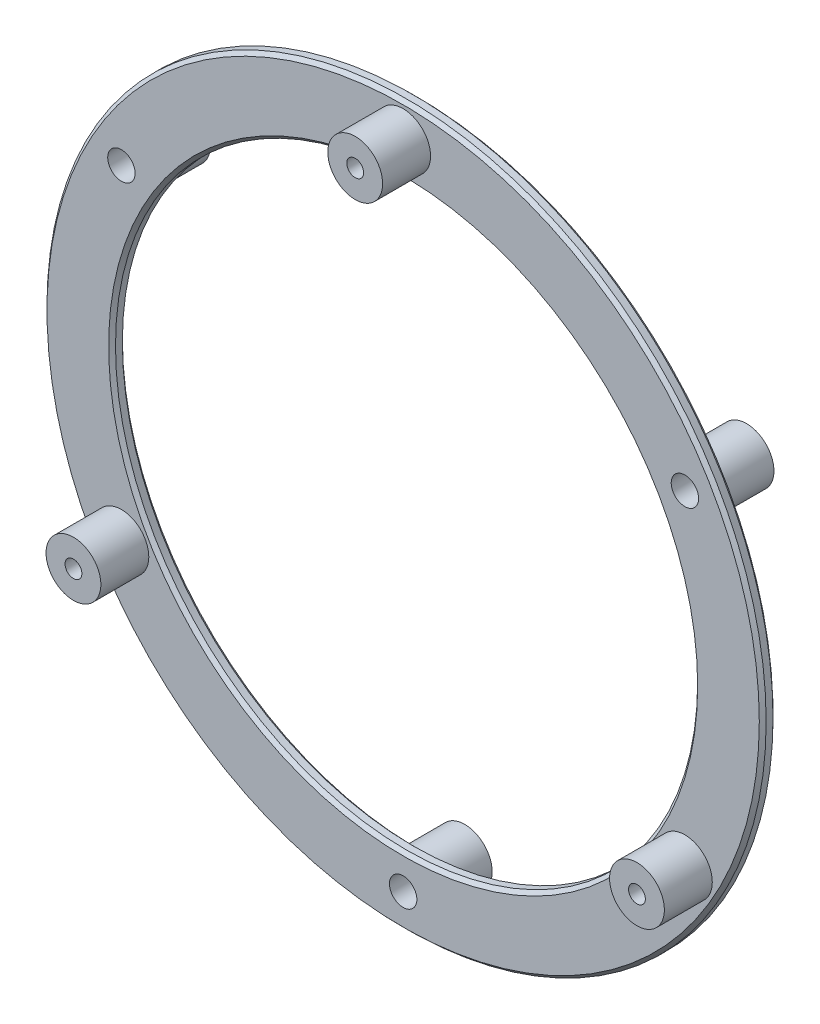
ISO-10303-21;
HEADER;
FILE_DESCRIPTION(('STEP AP214'),'2;1');
FILE_NAME('part.step','',(''),(''),'','','');
FILE_SCHEMA(('AUTOMOTIVE_DESIGN { 1 0 10303 214 1 1 1 1 }'));
ENDSEC;
DATA;
#1=APPLICATION_CONTEXT('core data for automotive mechanical design processes');
#2=APPLICATION_PROTOCOL_DEFINITION('international standard','automotive_design',2000,#1);
#3=PRODUCT_CONTEXT('',#1,'mechanical');
#4=PRODUCT('Part','Part','',(#3));
#5=PRODUCT_RELATED_PRODUCT_CATEGORY('part','',(#4));
#6=PRODUCT_DEFINITION_FORMATION('','',#4);
#7=PRODUCT_DEFINITION_CONTEXT('part definition',#1,'design');
#8=PRODUCT_DEFINITION('design','',#6,#7);
#9=PRODUCT_DEFINITION_SHAPE('','',#8);
#10=(LENGTH_UNIT() NAMED_UNIT(*) SI_UNIT(.MILLI.,.METRE.));
#11=(NAMED_UNIT(*) PLANE_ANGLE_UNIT() SI_UNIT($,.RADIAN.));
#12=(NAMED_UNIT(*) SI_UNIT($,.STERADIAN.) SOLID_ANGLE_UNIT());
#13=UNCERTAINTY_MEASURE_WITH_UNIT(LENGTH_MEASURE(1.E-05),#10,'distance_accuracy_value','');
#14=(GEOMETRIC_REPRESENTATION_CONTEXT(3) GLOBAL_UNCERTAINTY_ASSIGNED_CONTEXT((#13)) GLOBAL_UNIT_ASSIGNED_CONTEXT((#10,
#11,#12)) REPRESENTATION_CONTEXT('',''));
#15=CARTESIAN_POINT('',(0.,0.,0.));
#16=DIRECTION('',(0.,0.,1.));
#17=DIRECTION('',(1.,0.,0.));
#18=AXIS2_PLACEMENT_3D('',#15,#16,#17);
#19=CARTESIAN_POINT('',(0.,0.,2.));
#20=DIRECTION('',(0.,0.,-1.));
#21=DIRECTION('',(-1.,0.,0.));
#22=AXIS2_PLACEMENT_3D('',#19,#20,#21);
#23=CYLINDRICAL_SURFACE('',#22,52.5);
#24=CARTESIAN_POINT('',(0.,0.,0.500000000000007));
#25=DIRECTION('',(0.,0.,-1.));
#26=DIRECTION('',(-1.,0.,0.));
#27=AXIS2_PLACEMENT_3D('',#24,#25,#26);
#28=CIRCLE('',#27,52.5);
#29=CARTESIAN_POINT('',(-52.5,0.,0.500000000000007));
#30=VERTEX_POINT('',#29);
#31=EDGE_CURVE('E61',#30,#30,#28,.F.);
#32=ORIENTED_EDGE('',*,*,#31,.T.);
#33=EDGE_LOOP('',(#32));
#34=FACE_BOUND('',#33,.T.);
#35=CARTESIAN_POINT('',(0.,0.,1.50000000000003));
#36=DIRECTION('',(0.,0.,1.));
#37=DIRECTION('',(1.,0.,0.));
#38=AXIS2_PLACEMENT_3D('',#35,#36,#37);
#39=CIRCLE('',#38,52.5);
#40=CARTESIAN_POINT('',(52.5,0.,1.50000000000003));
#41=VERTEX_POINT('',#40);
#42=EDGE_CURVE('E64',#41,#41,#39,.F.);
#43=ORIENTED_EDGE('',*,*,#42,.T.);
#44=EDGE_LOOP('',(#43));
#45=FACE_BOUND('',#44,.T.);
#46=ADVANCED_FACE('F41',(#34,#45),#23,.T.);
#47=CARTESIAN_POINT('',(52.5,0.,2.));
#48=DIRECTION('',(0.,0.,1.));
#49=DIRECTION('',(1.,0.,0.));
#50=AXIS2_PLACEMENT_3D('',#47,#48,#49);
#51=PLANE('',#50);
#52=CARTESIAN_POINT('',(0.,0.,2.));
#53=DIRECTION('',(0.,0.,1.));
#54=DIRECTION('',(1.,0.,0.));
#55=AXIS2_PLACEMENT_3D('',#52,#53,#54);
#56=CIRCLE('',#55,52.);
#57=CARTESIAN_POINT('',(52.,0.,2.));
#58=VERTEX_POINT('',#57);
#59=EDGE_CURVE('E52',#58,#58,#56,.T.);
#60=ORIENTED_EDGE('',*,*,#59,.T.);
#61=EDGE_LOOP('',(#60));
#62=FACE_BOUND('',#61,.T.);
#63=CARTESIAN_POINT('',(0.,0.,2.));
#64=DIRECTION('',(0.,0.,1.));
#65=DIRECTION('',(1.,0.,0.));
#66=AXIS2_PLACEMENT_3D('',#63,#64,#65);
#67=CIRCLE('',#66,43.);
#68=CARTESIAN_POINT('',(43.,0.,2.));
#69=VERTEX_POINT('',#68);
#70=EDGE_CURVE('E56',#69,#69,#67,.F.);
#71=ORIENTED_EDGE('',*,*,#70,.T.);
#72=EDGE_LOOP('',(#71));
#73=FACE_BOUND('',#72,.T.);
#74=CARTESIAN_POINT('',(41.1362066797609,23.75,2.));
#75=DIRECTION('',(0.,0.,1.));
#76=DIRECTION('',(1.,0.,0.));
#77=AXIS2_PLACEMENT_3D('',#74,#75,#76);
#78=CIRCLE('',#77,1.99999999999999);
#79=CARTESIAN_POINT('',(43.1362066797608,23.75,2.));
#80=VERTEX_POINT('',#79);
#81=EDGE_CURVE('E139',#80,#80,#78,.T.);
#82=ORIENTED_EDGE('',*,*,#81,.F.);
#83=EDGE_LOOP('',(#82));
#84=FACE_BOUND('',#83,.T.);
#85=CARTESIAN_POINT('',(0.,-47.5,2.));
#86=DIRECTION('',(0.,0.,1.));
#87=DIRECTION('',(1.,0.,0.));
#88=AXIS2_PLACEMENT_3D('',#85,#86,#87);
#89=CIRCLE('',#88,1.99999999999999);
#90=CARTESIAN_POINT('',(2.,-47.5,2.));
#91=VERTEX_POINT('',#90);
#92=EDGE_CURVE('E133',#91,#91,#89,.T.);
#93=ORIENTED_EDGE('',*,*,#92,.F.);
#94=EDGE_LOOP('',(#93));
#95=FACE_BOUND('',#94,.T.);
#96=CARTESIAN_POINT('',(-41.1362066797608,23.75,2.));
#97=DIRECTION('',(0.,0.,1.));
#98=DIRECTION('',(1.,0.,0.));
#99=AXIS2_PLACEMENT_3D('',#96,#97,#98);
#100=CIRCLE('',#99,1.99999999999999);
#101=CARTESIAN_POINT('',(-39.1362066797608,23.75,2.));
#102=VERTEX_POINT('',#101);
#103=EDGE_CURVE('E127',#102,#102,#100,.T.);
#104=ORIENTED_EDGE('',*,*,#103,.F.);
#105=EDGE_LOOP('',(#104));
#106=FACE_BOUND('',#105,.T.);
#107=CARTESIAN_POINT('',(0.,47.5,2.));
#108=DIRECTION('',(0.,0.,1.));
#109=DIRECTION('',(1.,0.,0.));
#110=AXIS2_PLACEMENT_3D('',#107,#108,#109);
#111=CIRCLE('',#110,4.);
#112=CARTESIAN_POINT('',(4.,47.5,2.));
#113=VERTEX_POINT('',#112);
#114=EDGE_CURVE('E82',#113,#113,#111,.T.);
#115=ORIENTED_EDGE('',*,*,#114,.F.);
#116=EDGE_LOOP('',(#115));
#117=FACE_BOUND('',#116,.T.);
#118=CARTESIAN_POINT('',(-41.1362066797608,-23.75,2.));
#119=DIRECTION('',(0.,0.,1.));
#120=DIRECTION('',(1.,0.,0.));
#121=AXIS2_PLACEMENT_3D('',#118,#119,#120);
#122=CIRCLE('',#121,4.);
#123=CARTESIAN_POINT('',(-37.1362066797608,-23.75,2.));
#124=VERTEX_POINT('',#123);
#125=EDGE_CURVE('E85',#124,#124,#122,.T.);
#126=ORIENTED_EDGE('',*,*,#125,.F.);
#127=EDGE_LOOP('',(#126));
#128=FACE_BOUND('',#127,.T.);
#129=CARTESIAN_POINT('',(41.1362066797608,-23.75,2.));
#130=DIRECTION('',(0.,0.,1.));
#131=DIRECTION('',(1.,0.,0.));
#132=AXIS2_PLACEMENT_3D('',#129,#130,#131);
#133=CIRCLE('',#132,4.);
#134=CARTESIAN_POINT('',(45.1362066797608,-23.75,2.));
#135=VERTEX_POINT('',#134);
#136=EDGE_CURVE('E88',#135,#135,#133,.T.);
#137=ORIENTED_EDGE('',*,*,#136,.F.);
#138=EDGE_LOOP('',(#137));
#139=FACE_BOUND('',#138,.T.);
#140=ADVANCED_FACE('F165',(#62,#73,#84,#95,#106,#117,#128,#139),#51,.T.);
#141=CARTESIAN_POINT('',(0.,0.,0.));
#142=DIRECTION('',(0.,0.,-1.));
#143=DIRECTION('',(-1.,0.,0.));
#144=AXIS2_PLACEMENT_3D('',#141,#142,#143);
#145=PLANE('',#144);
#146=CARTESIAN_POINT('',(0.,0.,0.));
#147=DIRECTION('',(0.,0.,-1.));
#148=DIRECTION('',(-1.,0.,0.));
#149=AXIS2_PLACEMENT_3D('',#146,#147,#148);
#150=CIRCLE('',#149,52.);
#151=CARTESIAN_POINT('',(-52.,0.,0.));
#152=VERTEX_POINT('',#151);
#153=EDGE_CURVE('E67',#152,#152,#150,.T.);
#154=ORIENTED_EDGE('',*,*,#153,.T.);
#155=EDGE_LOOP('',(#154));
#156=FACE_BOUND('',#155,.T.);
#157=CARTESIAN_POINT('',(0.,0.,0.));
#158=DIRECTION('',(0.,0.,-1.));
#159=DIRECTION('',(-1.,0.,0.));
#160=AXIS2_PLACEMENT_3D('',#157,#158,#159);
#161=CIRCLE('',#160,43.);
#162=CARTESIAN_POINT('',(-43.,0.,0.));
#163=VERTEX_POINT('',#162);
#164=EDGE_CURVE('E70',#163,#163,#161,.F.);
#165=ORIENTED_EDGE('',*,*,#164,.T.);
#166=EDGE_LOOP('',(#165));
#167=FACE_BOUND('',#166,.T.);
#168=CARTESIAN_POINT('',(41.1362066797608,-23.75,0.));
#169=DIRECTION('',(0.,0.,1.));
#170=DIRECTION('',(1.,0.,0.));
#171=AXIS2_PLACEMENT_3D('',#168,#169,#170);
#172=CIRCLE('',#171,1.2295);
#173=CARTESIAN_POINT('',(42.3657066797608,-23.75,0.));
#174=VERTEX_POINT('',#173);
#175=EDGE_CURVE('E121',#174,#174,#172,.T.);
#176=ORIENTED_EDGE('',*,*,#175,.T.);
#177=EDGE_LOOP('',(#176));
#178=FACE_BOUND('',#177,.T.);
#179=CARTESIAN_POINT('',(-41.1362066797608,-23.75,0.));
#180=DIRECTION('',(0.,0.,1.));
#181=DIRECTION('',(1.,0.,0.));
#182=AXIS2_PLACEMENT_3D('',#179,#180,#181);
#183=CIRCLE('',#182,1.2295);
#184=CARTESIAN_POINT('',(-39.9067066797608,-23.75,0.));
#185=VERTEX_POINT('',#184);
#186=EDGE_CURVE('E115',#185,#185,#183,.T.);
#187=ORIENTED_EDGE('',*,*,#186,.T.);
#188=EDGE_LOOP('',(#187));
#189=FACE_BOUND('',#188,.T.);
#190=CARTESIAN_POINT('',(0.,47.5,0.));
#191=DIRECTION('',(0.,0.,1.));
#192=DIRECTION('',(1.,0.,0.));
#193=AXIS2_PLACEMENT_3D('',#190,#191,#192);
#194=CIRCLE('',#193,1.2295);
#195=CARTESIAN_POINT('',(1.2295,47.5,0.));
#196=VERTEX_POINT('',#195);
#197=EDGE_CURVE('E109',#196,#196,#194,.T.);
#198=ORIENTED_EDGE('',*,*,#197,.T.);
#199=EDGE_LOOP('',(#198));
#200=FACE_BOUND('',#199,.T.);
#201=CARTESIAN_POINT('',(0.,-47.5,0.));
#202=DIRECTION('',(0.,0.,-1.));
#203=DIRECTION('',(-1.,0.,0.));
#204=AXIS2_PLACEMENT_3D('',#201,#202,#203);
#205=CIRCLE('',#204,4.);
#206=CARTESIAN_POINT('',(-3.99999999999999,-47.5,0.));
#207=VERTEX_POINT('',#206);
#208=EDGE_CURVE('E73',#207,#207,#205,.T.);
#209=ORIENTED_EDGE('',*,*,#208,.F.);
#210=EDGE_LOOP('',(#209));
#211=FACE_BOUND('',#210,.T.);
#212=CARTESIAN_POINT('',(-41.1362066797608,23.75,0.));
#213=DIRECTION('',(0.,0.,-1.));
#214=DIRECTION('',(-1.,0.,0.));
#215=AXIS2_PLACEMENT_3D('',#212,#213,#214);
#216=CIRCLE('',#215,4.);
#217=CARTESIAN_POINT('',(-45.1362066797608,23.75,0.));
#218=VERTEX_POINT('',#217);
#219=EDGE_CURVE('E76',#218,#218,#216,.T.);
#220=ORIENTED_EDGE('',*,*,#219,.F.);
#221=EDGE_LOOP('',(#220));
#222=FACE_BOUND('',#221,.T.);
#223=CARTESIAN_POINT('',(41.1362066797609,23.75,0.));
#224=DIRECTION('',(0.,0.,-1.));
#225=DIRECTION('',(-1.,0.,0.));
#226=AXIS2_PLACEMENT_3D('',#223,#224,#225);
#227=CIRCLE('',#226,4.);
#228=CARTESIAN_POINT('',(37.1362066797608,23.75,0.));
#229=VERTEX_POINT('',#228);
#230=EDGE_CURVE('E79',#229,#229,#227,.T.);
#231=ORIENTED_EDGE('',*,*,#230,.F.);
#232=EDGE_LOOP('',(#231));
#233=FACE_BOUND('',#232,.T.);
#234=ADVANCED_FACE('F162',(#156,#167,#178,#189,#200,#211,#222,#233),#145,.T.);
#235=CARTESIAN_POINT('',(41.1362066797608,-23.75,9.));
#236=DIRECTION('',(0.,0.,-1.));
#237=DIRECTION('',(-1.,0.,0.));
#238=AXIS2_PLACEMENT_3D('',#235,#236,#237);
#239=CYLINDRICAL_SURFACE('',#238,4.);
#240=CARTESIAN_POINT('',(41.1362066797608,-23.75,9.));
#241=DIRECTION('',(0.,0.,-1.));
#242=DIRECTION('',(-1.,0.,0.));
#243=AXIS2_PLACEMENT_3D('',#240,#241,#242);
#244=CIRCLE('',#243,4.);
#245=CARTESIAN_POINT('',(37.1362066797608,-23.75,9.));
#246=VERTEX_POINT('',#245);
#247=EDGE_CURVE('E91',#246,#246,#244,.T.);
#248=ORIENTED_EDGE('',*,*,#247,.T.);
#249=EDGE_LOOP('',(#248));
#250=FACE_BOUND('',#249,.T.);
#251=ORIENTED_EDGE('',*,*,#136,.T.);
#252=EDGE_LOOP('',(#251));
#253=FACE_BOUND('',#252,.T.);
#254=ADVANCED_FACE('F164',(#250,#253),#239,.T.);
#255=CARTESIAN_POINT('',(45.1362066797608,-23.75,9.));
#256=DIRECTION('',(0.,0.,1.));
#257=DIRECTION('',(1.,0.,0.));
#258=AXIS2_PLACEMENT_3D('',#255,#256,#257);
#259=PLANE('',#258);
#260=CARTESIAN_POINT('',(41.1362066797608,-23.75,9.00000000000001));
#261=DIRECTION('',(0.,0.,1.));
#262=DIRECTION('',(1.,0.,0.));
#263=AXIS2_PLACEMENT_3D('',#260,#261,#262);
#264=CIRCLE('',#263,1.2295);
#265=CARTESIAN_POINT('',(42.3657066797608,-23.75,9.00000000000001));
#266=VERTEX_POINT('',#265);
#267=EDGE_CURVE('E124',#266,#266,#264,.T.);
#268=ORIENTED_EDGE('',*,*,#267,.F.);
#269=EDGE_LOOP('',(#268));
#270=FACE_BOUND('',#269,.T.);
#271=ORIENTED_EDGE('',*,*,#247,.F.);
#272=EDGE_LOOP('',(#271));
#273=FACE_BOUND('',#272,.T.);
#274=ADVANCED_FACE('F172',(#270,#273),#259,.T.);
#275=CARTESIAN_POINT('',(-41.1362066797608,-23.75,9.));
#276=DIRECTION('',(0.,0.,-1.));
#277=DIRECTION('',(-1.,0.,0.));
#278=AXIS2_PLACEMENT_3D('',#275,#276,#277);
#279=CYLINDRICAL_SURFACE('',#278,4.);
#280=CARTESIAN_POINT('',(-41.1362066797608,-23.75,9.));
#281=DIRECTION('',(0.,0.,-1.));
#282=DIRECTION('',(-1.,0.,0.));
#283=AXIS2_PLACEMENT_3D('',#280,#281,#282);
#284=CIRCLE('',#283,4.);
#285=CARTESIAN_POINT('',(-45.1362066797608,-23.75,9.));
#286=VERTEX_POINT('',#285);
#287=EDGE_CURVE('E94',#286,#286,#284,.T.);
#288=ORIENTED_EDGE('',*,*,#287,.T.);
#289=EDGE_LOOP('',(#288));
#290=FACE_BOUND('',#289,.T.);
#291=ORIENTED_EDGE('',*,*,#125,.T.);
#292=EDGE_LOOP('',(#291));
#293=FACE_BOUND('',#292,.T.);
#294=ADVANCED_FACE('F235',(#290,#293),#279,.T.);
#295=CARTESIAN_POINT('',(-37.1362066797608,-23.75,9.));
#296=DIRECTION('',(0.,0.,1.));
#297=DIRECTION('',(1.,0.,0.));
#298=AXIS2_PLACEMENT_3D('',#295,#296,#297);
#299=PLANE('',#298);
#300=CARTESIAN_POINT('',(-41.1362066797608,-23.75,9.00000000000001));
#301=DIRECTION('',(0.,0.,1.));
#302=DIRECTION('',(1.,0.,0.));
#303=AXIS2_PLACEMENT_3D('',#300,#301,#302);
#304=CIRCLE('',#303,1.2295);
#305=CARTESIAN_POINT('',(-39.9067066797608,-23.75,9.00000000000001));
#306=VERTEX_POINT('',#305);
#307=EDGE_CURVE('E118',#306,#306,#304,.T.);
#308=ORIENTED_EDGE('',*,*,#307,.F.);
#309=EDGE_LOOP('',(#308));
#310=FACE_BOUND('',#309,.T.);
#311=ORIENTED_EDGE('',*,*,#287,.F.);
#312=EDGE_LOOP('',(#311));
#313=FACE_BOUND('',#312,.T.);
#314=ADVANCED_FACE('F231',(#310,#313),#299,.T.);
#315=CARTESIAN_POINT('',(0.,47.5,9.));
#316=DIRECTION('',(0.,0.,-1.));
#317=DIRECTION('',(-1.,0.,0.));
#318=AXIS2_PLACEMENT_3D('',#315,#316,#317);
#319=CYLINDRICAL_SURFACE('',#318,4.);
#320=CARTESIAN_POINT('',(0.,47.5,9.));
#321=DIRECTION('',(0.,0.,-1.));
#322=DIRECTION('',(-1.,0.,0.));
#323=AXIS2_PLACEMENT_3D('',#320,#321,#322);
#324=CIRCLE('',#323,4.);
#325=CARTESIAN_POINT('',(-4.,47.5,9.));
#326=VERTEX_POINT('',#325);
#327=EDGE_CURVE('E97',#326,#326,#324,.T.);
#328=ORIENTED_EDGE('',*,*,#327,.T.);
#329=EDGE_LOOP('',(#328));
#330=FACE_BOUND('',#329,.T.);
#331=ORIENTED_EDGE('',*,*,#114,.T.);
#332=EDGE_LOOP('',(#331));
#333=FACE_BOUND('',#332,.T.);
#334=ADVANCED_FACE('F227',(#330,#333),#319,.T.);
#335=CARTESIAN_POINT('',(4.,47.5,9.));
#336=DIRECTION('',(0.,0.,1.));
#337=DIRECTION('',(1.,0.,0.));
#338=AXIS2_PLACEMENT_3D('',#335,#336,#337);
#339=PLANE('',#338);
#340=CARTESIAN_POINT('',(0.,47.5,9.00000000000001));
#341=DIRECTION('',(0.,0.,1.));
#342=DIRECTION('',(1.,0.,0.));
#343=AXIS2_PLACEMENT_3D('',#340,#341,#342);
#344=CIRCLE('',#343,1.2295);
#345=CARTESIAN_POINT('',(1.2295,47.5,9.00000000000001));
#346=VERTEX_POINT('',#345);
#347=EDGE_CURVE('E112',#346,#346,#344,.T.);
#348=ORIENTED_EDGE('',*,*,#347,.F.);
#349=EDGE_LOOP('',(#348));
#350=FACE_BOUND('',#349,.T.);
#351=ORIENTED_EDGE('',*,*,#327,.F.);
#352=EDGE_LOOP('',(#351));
#353=FACE_BOUND('',#352,.T.);
#354=ADVANCED_FACE('F158',(#350,#353),#339,.T.);
#355=CARTESIAN_POINT('',(41.1362066797609,23.75,-7.));
#356=DIRECTION('',(0.,0.,1.));
#357=DIRECTION('',(1.,0.,0.));
#358=AXIS2_PLACEMENT_3D('',#355,#356,#357);
#359=CYLINDRICAL_SURFACE('',#358,4.);
#360=CARTESIAN_POINT('',(41.1362066797609,23.75,-7.));
#361=DIRECTION('',(0.,0.,1.));
#362=DIRECTION('',(1.,0.,0.));
#363=AXIS2_PLACEMENT_3D('',#360,#361,#362);
#364=CIRCLE('',#363,4.);
#365=CARTESIAN_POINT('',(45.1362066797609,23.75,-7.));
#366=VERTEX_POINT('',#365);
#367=EDGE_CURVE('E100',#366,#366,#364,.T.);
#368=ORIENTED_EDGE('',*,*,#367,.T.);
#369=EDGE_LOOP('',(#368));
#370=FACE_BOUND('',#369,.T.);
#371=ORIENTED_EDGE('',*,*,#230,.T.);
#372=EDGE_LOOP('',(#371));
#373=FACE_BOUND('',#372,.T.);
#374=ADVANCED_FACE('F152',(#370,#373),#359,.T.);
#375=CARTESIAN_POINT('',(45.1362066797609,23.75,-7.));
#376=DIRECTION('',(0.,0.,-1.));
#377=DIRECTION('',(-1.,0.,0.));
#378=AXIS2_PLACEMENT_3D('',#375,#376,#377);
#379=PLANE('',#378);
#380=CARTESIAN_POINT('',(41.1362066797609,23.75,-7.));
#381=DIRECTION('',(0.,0.,-1.));
#382=DIRECTION('',(-1.,0.,0.));
#383=AXIS2_PLACEMENT_3D('',#380,#381,#382);
#384=CIRCLE('',#383,1.99999999999999);
#385=CARTESIAN_POINT('',(39.1362066797609,23.75,-7.));
#386=VERTEX_POINT('',#385);
#387=EDGE_CURVE('E142',#386,#386,#384,.T.);
#388=ORIENTED_EDGE('',*,*,#387,.F.);
#389=EDGE_LOOP('',(#388));
#390=FACE_BOUND('',#389,.T.);
#391=ORIENTED_EDGE('',*,*,#367,.F.);
#392=EDGE_LOOP('',(#391));
#393=FACE_BOUND('',#392,.T.);
#394=ADVANCED_FACE('F148',(#390,#393),#379,.T.);
#395=CARTESIAN_POINT('',(-41.1362066797608,23.75,-7.));
#396=DIRECTION('',(0.,0.,1.));
#397=DIRECTION('',(1.,0.,0.));
#398=AXIS2_PLACEMENT_3D('',#395,#396,#397);
#399=CYLINDRICAL_SURFACE('',#398,4.);
#400=CARTESIAN_POINT('',(-41.1362066797608,23.75,-7.));
#401=DIRECTION('',(0.,0.,1.));
#402=DIRECTION('',(1.,0.,0.));
#403=AXIS2_PLACEMENT_3D('',#400,#401,#402);
#404=CIRCLE('',#403,4.);
#405=CARTESIAN_POINT('',(-37.1362066797608,23.75,-7.));
#406=VERTEX_POINT('',#405);
#407=EDGE_CURVE('E103',#406,#406,#404,.T.);
#408=ORIENTED_EDGE('',*,*,#407,.T.);
#409=EDGE_LOOP('',(#408));
#410=FACE_BOUND('',#409,.T.);
#411=ORIENTED_EDGE('',*,*,#219,.T.);
#412=EDGE_LOOP('',(#411));
#413=FACE_BOUND('',#412,.T.);
#414=ADVANCED_FACE('F151',(#410,#413),#399,.T.);
#415=CARTESIAN_POINT('',(-37.1362066797608,23.75,-7.));
#416=DIRECTION('',(0.,0.,-1.));
#417=DIRECTION('',(-1.,0.,0.));
#418=AXIS2_PLACEMENT_3D('',#415,#416,#417);
#419=PLANE('',#418);
#420=CARTESIAN_POINT('',(-41.1362066797608,23.75,-7.));
#421=DIRECTION('',(0.,0.,-1.));
#422=DIRECTION('',(-1.,0.,0.));
#423=AXIS2_PLACEMENT_3D('',#420,#421,#422);
#424=CIRCLE('',#423,1.99999999999999);
#425=CARTESIAN_POINT('',(-43.1362066797608,23.75,-7.));
#426=VERTEX_POINT('',#425);
#427=EDGE_CURVE('E130',#426,#426,#424,.T.);
#428=ORIENTED_EDGE('',*,*,#427,.F.);
#429=EDGE_LOOP('',(#428));
#430=FACE_BOUND('',#429,.T.);
#431=ORIENTED_EDGE('',*,*,#407,.F.);
#432=EDGE_LOOP('',(#431));
#433=FACE_BOUND('',#432,.T.);
#434=ADVANCED_FACE('F214',(#430,#433),#419,.T.);
#435=CARTESIAN_POINT('',(0.,-47.5,-7.));
#436=DIRECTION('',(0.,0.,1.));
#437=DIRECTION('',(1.,0.,0.));
#438=AXIS2_PLACEMENT_3D('',#435,#436,#437);
#439=CYLINDRICAL_SURFACE('',#438,4.);
#440=CARTESIAN_POINT('',(0.,-47.5,-7.));
#441=DIRECTION('',(0.,0.,1.));
#442=DIRECTION('',(1.,0.,0.));
#443=AXIS2_PLACEMENT_3D('',#440,#441,#442);
#444=CIRCLE('',#443,4.);
#445=CARTESIAN_POINT('',(4.00000000000001,-47.5,-7.));
#446=VERTEX_POINT('',#445);
#447=EDGE_CURVE('E106',#446,#446,#444,.T.);
#448=ORIENTED_EDGE('',*,*,#447,.T.);
#449=EDGE_LOOP('',(#448));
#450=FACE_BOUND('',#449,.T.);
#451=ORIENTED_EDGE('',*,*,#208,.T.);
#452=EDGE_LOOP('',(#451));
#453=FACE_BOUND('',#452,.T.);
#454=ADVANCED_FACE('F220',(#450,#453),#439,.T.);
#455=CARTESIAN_POINT('',(4.00000000000001,-47.5,-7.));
#456=DIRECTION('',(0.,0.,-1.));
#457=DIRECTION('',(-1.,0.,0.));
#458=AXIS2_PLACEMENT_3D('',#455,#456,#457);
#459=PLANE('',#458);
#460=CARTESIAN_POINT('',(0.,-47.5,-7.));
#461=DIRECTION('',(0.,0.,-1.));
#462=DIRECTION('',(-1.,0.,0.));
#463=AXIS2_PLACEMENT_3D('',#460,#461,#462);
#464=CIRCLE('',#463,1.99999999999999);
#465=CARTESIAN_POINT('',(-1.99999999999998,-47.5,-7.));
#466=VERTEX_POINT('',#465);
#467=EDGE_CURVE('E136',#466,#466,#464,.T.);
#468=ORIENTED_EDGE('',*,*,#467,.F.);
#469=EDGE_LOOP('',(#468));
#470=FACE_BOUND('',#469,.T.);
#471=ORIENTED_EDGE('',*,*,#447,.F.);
#472=EDGE_LOOP('',(#471));
#473=FACE_BOUND('',#472,.T.);
#474=ADVANCED_FACE('F271',(#470,#473),#459,.T.);
#475=CARTESIAN_POINT('',(0.,47.5,0.));
#476=DIRECTION('',(0.,0.,1.));
#477=DIRECTION('',(1.,0.,0.));
#478=AXIS2_PLACEMENT_3D('',#475,#476,#477);
#479=CYLINDRICAL_SURFACE('',#478,1.2295);
#480=ORIENTED_EDGE('',*,*,#197,.F.);
#481=EDGE_LOOP('',(#480));
#482=FACE_BOUND('',#481,.T.);
#483=ORIENTED_EDGE('',*,*,#347,.T.);
#484=EDGE_LOOP('',(#483));
#485=FACE_BOUND('',#484,.T.);
#486=ADVANCED_FACE('F264',(#482,#485),#479,.F.);
#487=CARTESIAN_POINT('',(-41.1362066797608,-23.75,0.));
#488=DIRECTION('',(0.,0.,1.));
#489=DIRECTION('',(1.,0.,0.));
#490=AXIS2_PLACEMENT_3D('',#487,#488,#489);
#491=CYLINDRICAL_SURFACE('',#490,1.2295);
#492=ORIENTED_EDGE('',*,*,#186,.F.);
#493=EDGE_LOOP('',(#492));
#494=FACE_BOUND('',#493,.T.);
#495=ORIENTED_EDGE('',*,*,#307,.T.);
#496=EDGE_LOOP('',(#495));
#497=FACE_BOUND('',#496,.T.);
#498=ADVANCED_FACE('F254',(#494,#497),#491,.F.);
#499=CARTESIAN_POINT('',(41.1362066797608,-23.75,0.));
#500=DIRECTION('',(0.,0.,1.));
#501=DIRECTION('',(1.,0.,0.));
#502=AXIS2_PLACEMENT_3D('',#499,#500,#501);
#503=CYLINDRICAL_SURFACE('',#502,1.2295);
#504=ORIENTED_EDGE('',*,*,#175,.F.);
#505=EDGE_LOOP('',(#504));
#506=FACE_BOUND('',#505,.T.);
#507=ORIENTED_EDGE('',*,*,#267,.T.);
#508=EDGE_LOOP('',(#507));
#509=FACE_BOUND('',#508,.T.);
#510=ADVANCED_FACE('F251',(#506,#509),#503,.F.);
#511=CARTESIAN_POINT('',(-41.1362066797608,23.75,-7.));
#512=DIRECTION('',(0.,0.,-1.));
#513=DIRECTION('',(-1.,0.,0.));
#514=AXIS2_PLACEMENT_3D('',#511,#512,#513);
#515=CYLINDRICAL_SURFACE('',#514,1.99999999999999);
#516=ORIENTED_EDGE('',*,*,#103,.T.);
#517=EDGE_LOOP('',(#516));
#518=FACE_BOUND('',#517,.T.);
#519=ORIENTED_EDGE('',*,*,#427,.T.);
#520=EDGE_LOOP('',(#519));
#521=FACE_BOUND('',#520,.T.);
#522=ADVANCED_FACE('F253',(#518,#521),#515,.F.);
#523=CARTESIAN_POINT('',(0.,-47.5,-7.));
#524=DIRECTION('',(0.,0.,-1.));
#525=DIRECTION('',(-1.,0.,0.));
#526=AXIS2_PLACEMENT_3D('',#523,#524,#525);
#527=CYLINDRICAL_SURFACE('',#526,1.99999999999999);
#528=ORIENTED_EDGE('',*,*,#92,.T.);
#529=EDGE_LOOP('',(#528));
#530=FACE_BOUND('',#529,.T.);
#531=ORIENTED_EDGE('',*,*,#467,.T.);
#532=EDGE_LOOP('',(#531));
#533=FACE_BOUND('',#532,.T.);
#534=ADVANCED_FACE('F261',(#530,#533),#527,.F.);
#535=CARTESIAN_POINT('',(41.1362066797609,23.75,-7.));
#536=DIRECTION('',(0.,0.,-1.));
#537=DIRECTION('',(-1.,0.,0.));
#538=AXIS2_PLACEMENT_3D('',#535,#536,#537);
#539=CYLINDRICAL_SURFACE('',#538,1.99999999999999);
#540=ORIENTED_EDGE('',*,*,#81,.T.);
#541=EDGE_LOOP('',(#540));
#542=FACE_BOUND('',#541,.T.);
#543=ORIENTED_EDGE('',*,*,#387,.T.);
#544=EDGE_LOOP('',(#543));
#545=FACE_BOUND('',#544,.T.);
#546=ADVANCED_FACE('F146',(#542,#545),#539,.F.);
#547=CARTESIAN_POINT('',(0.,0.,2.));
#548=DIRECTION('',(0.,0.,1.));
#549=DIRECTION('',(1.,0.,0.));
#550=AXIS2_PLACEMENT_3D('',#547,#548,#549);
#551=CYLINDRICAL_SURFACE('',#550,42.5);
#552=CARTESIAN_POINT('',(0.,0.,0.499999999999973));
#553=DIRECTION('',(0.,0.,-1.));
#554=DIRECTION('',(-1.,0.,0.));
#555=AXIS2_PLACEMENT_3D('',#552,#553,#554);
#556=CIRCLE('',#555,42.5);
#557=CARTESIAN_POINT('',(-42.5,0.,0.499999999999973));
#558=VERTEX_POINT('',#557);
#559=EDGE_CURVE('E10',#558,#558,#556,.T.);
#560=ORIENTED_EDGE('',*,*,#559,.T.);
#561=EDGE_LOOP('',(#560));
#562=FACE_BOUND('',#561,.T.);
#563=CARTESIAN_POINT('',(0.,0.,1.49999999999997));
#564=DIRECTION('',(0.,0.,1.));
#565=DIRECTION('',(1.,0.,0.));
#566=AXIS2_PLACEMENT_3D('',#563,#564,#565);
#567=CIRCLE('',#566,42.5);
#568=CARTESIAN_POINT('',(42.5,0.,1.49999999999997));
#569=VERTEX_POINT('',#568);
#570=EDGE_CURVE('E48',#569,#569,#567,.T.);
#571=ORIENTED_EDGE('',*,*,#570,.T.);
#572=EDGE_LOOP('',(#571));
#573=FACE_BOUND('',#572,.T.);
#574=ADVANCED_FACE('F189',(#562,#573),#551,.F.);
#575=CARTESIAN_POINT('',(0.,0.,0.));
#576=DIRECTION('',(0.,0.,1.));
#577=DIRECTION('',(1.,0.,0.));
#578=AXIS2_PLACEMENT_3D('',#575,#576,#577);
#579=CONICAL_SURFACE('',#578,52.,0.785398163397462);
#580=ORIENTED_EDGE('',*,*,#31,.F.);
#581=EDGE_LOOP('',(#580));
#582=FACE_BOUND('',#581,.T.);
#583=ORIENTED_EDGE('',*,*,#153,.F.);
#584=EDGE_LOOP('',(#583));
#585=FACE_BOUND('',#584,.T.);
#586=ADVANCED_FACE('F185',(#582,#585),#579,.T.);
#587=CARTESIAN_POINT('',(0.,0.,1.50000000000003));
#588=DIRECTION('',(0.,0.,-1.));
#589=DIRECTION('',(-1.,0.,0.));
#590=AXIS2_PLACEMENT_3D('',#587,#588,#589);
#591=CONICAL_SURFACE('',#590,52.5,0.785398163397462);
#592=ORIENTED_EDGE('',*,*,#59,.F.);
#593=EDGE_LOOP('',(#592));
#594=FACE_BOUND('',#593,.T.);
#595=ORIENTED_EDGE('',*,*,#42,.F.);
#596=EDGE_LOOP('',(#595));
#597=FACE_BOUND('',#596,.T.);
#598=ADVANCED_FACE('F188',(#594,#597),#591,.T.);
#599=CARTESIAN_POINT('',(0.,0.,0.499999999999973));
#600=DIRECTION('',(0.,0.,-1.));
#601=DIRECTION('',(-1.,0.,0.));
#602=AXIS2_PLACEMENT_3D('',#599,#600,#601);
#603=CONICAL_SURFACE('',#602,42.5,0.785398163397455);
#604=ORIENTED_EDGE('',*,*,#164,.F.);
#605=EDGE_LOOP('',(#604));
#606=FACE_BOUND('',#605,.T.);
#607=ORIENTED_EDGE('',*,*,#559,.F.);
#608=EDGE_LOOP('',(#607));
#609=FACE_BOUND('',#608,.T.);
#610=ADVANCED_FACE('F192',(#606,#609),#603,.F.);
#611=CARTESIAN_POINT('',(0.,0.,1.49999999999997));
#612=DIRECTION('',(0.,0.,1.));
#613=DIRECTION('',(1.,0.,0.));
#614=AXIS2_PLACEMENT_3D('',#611,#612,#613);
#615=CONICAL_SURFACE('',#614,42.5,0.785398163397441);
#616=ORIENTED_EDGE('',*,*,#70,.F.);
#617=EDGE_LOOP('',(#616));
#618=FACE_BOUND('',#617,.T.);
#619=ORIENTED_EDGE('',*,*,#570,.F.);
#620=EDGE_LOOP('',(#619));
#621=FACE_BOUND('',#620,.T.);
#622=ADVANCED_FACE('F43',(#618,#621),#615,.F.);
#623=CLOSED_SHELL('',(#46,#140,#234,#254,#274,#294,#314,#334,#354,#374,#394,#414,#434,#454,#474,
#486,#498,#510,#522,#534,#546,#574,#586,#598,#610,#622));
#624=MANIFOLD_SOLID_BREP('B2',#623);
#625=ADVANCED_BREP_SHAPE_REPRESENTATION('',(#18,#624),#14);
#626=SHAPE_DEFINITION_REPRESENTATION(#9,#625);
ENDSEC;
END-ISO-10303-21;
